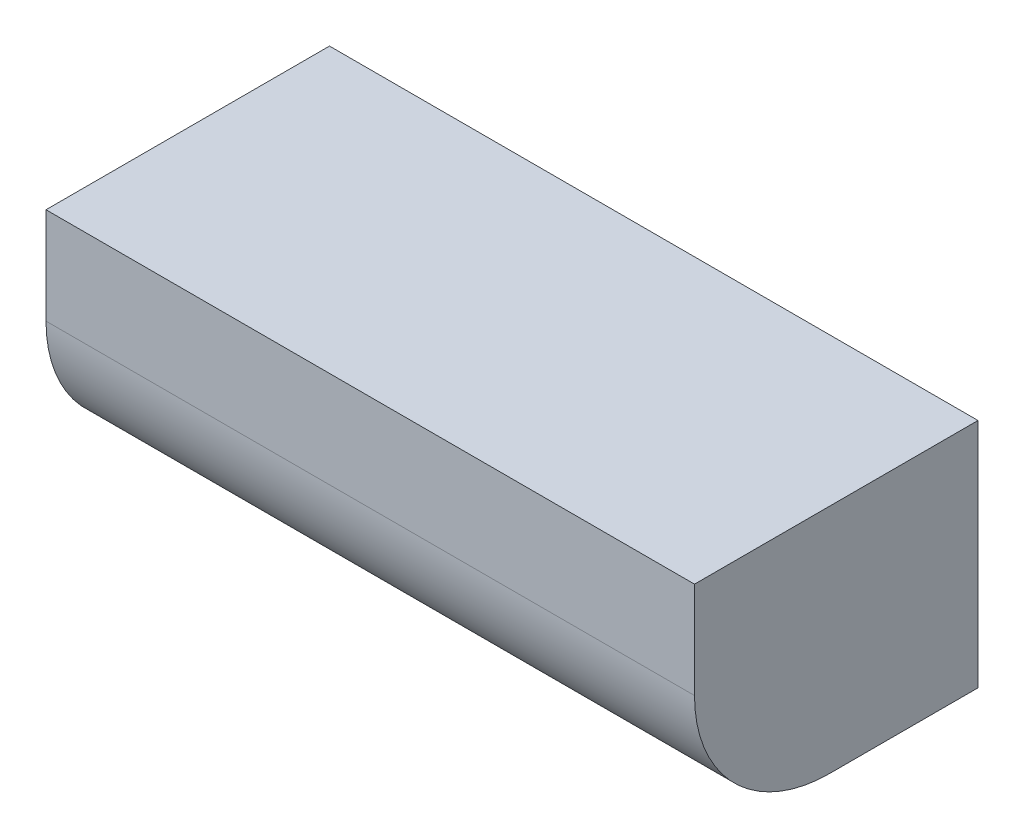
ISO-10303-21;
HEADER;
FILE_DESCRIPTION(('STEP AP214'),'2;1');
FILE_NAME('part.step','',(''),(''),'','','');
FILE_SCHEMA(('AUTOMOTIVE_DESIGN { 1 0 10303 214 1 1 1 1 }'));
ENDSEC;
DATA;
#1=APPLICATION_CONTEXT('core data for automotive mechanical design processes');
#2=APPLICATION_PROTOCOL_DEFINITION('international standard','automotive_design',2000,#1);
#3=PRODUCT_CONTEXT('',#1,'mechanical');
#4=PRODUCT('Part','Part','',(#3));
#5=PRODUCT_RELATED_PRODUCT_CATEGORY('part','',(#4));
#6=PRODUCT_DEFINITION_FORMATION('','',#4);
#7=PRODUCT_DEFINITION_CONTEXT('part definition',#1,'design');
#8=PRODUCT_DEFINITION('design','',#6,#7);
#9=PRODUCT_DEFINITION_SHAPE('','',#8);
#10=(LENGTH_UNIT() NAMED_UNIT(*) SI_UNIT(.MILLI.,.METRE.));
#11=(NAMED_UNIT(*) PLANE_ANGLE_UNIT() SI_UNIT($,.RADIAN.));
#12=(NAMED_UNIT(*) SI_UNIT($,.STERADIAN.) SOLID_ANGLE_UNIT());
#13=UNCERTAINTY_MEASURE_WITH_UNIT(LENGTH_MEASURE(1.E-05),#10,'distance_accuracy_value','');
#14=(GEOMETRIC_REPRESENTATION_CONTEXT(3) GLOBAL_UNCERTAINTY_ASSIGNED_CONTEXT((#13)) GLOBAL_UNIT_ASSIGNED_CONTEXT((#10,
#11,#12)) REPRESENTATION_CONTEXT('',''));
#15=CARTESIAN_POINT('',(0.,0.,0.));
#16=DIRECTION('',(0.,0.,1.));
#17=DIRECTION('',(1.,0.,0.));
#18=AXIS2_PLACEMENT_3D('',#15,#16,#17);
#19=CARTESIAN_POINT('',(0.,0.,10.));
#20=DIRECTION('',(1.,0.,0.));
#21=DIRECTION('',(0.,0.,-1.));
#22=AXIS2_PLACEMENT_3D('',#19,#20,#21);
#23=PLANE('',#22);
#24=DIRECTION('',(0.,0.,-1.));
#25=VECTOR('',#24,1.);
#26=CARTESIAN_POINT('',(0.,10.8609375,-17.8082122));
#27=LINE('',#26,#25);
#28=CARTESIAN_POINT('',(0.,10.8609375,-10.));
#29=VERTEX_POINT('',#28);
#30=CARTESIAN_POINT('',(0.,10.8609375,-20.9832122));
#31=VERTEX_POINT('',#30);
#32=EDGE_CURVE('E109',#29,#31,#27,.T.);
#33=ORIENTED_EDGE('',*,*,#32,.F.);
#34=CARTESIAN_POINT('',(0.,20.8609375,-10.));
#35=DIRECTION('',(1.,0.,0.));
#36=DIRECTION('',(0.,0.,-1.));
#37=AXIS2_PLACEMENT_3D('',#34,#35,#36);
#38=CIRCLE('',#37,10.);
#39=CARTESIAN_POINT('',(0.,20.8609374999999,0.));
#40=VERTEX_POINT('',#39);
#41=EDGE_CURVE('E106',#40,#29,#38,.T.);
#42=ORIENTED_EDGE('',*,*,#41,.F.);
#43=DIRECTION('',(0.,-1.,0.));
#44=VECTOR('',#43,1.);
#45=CARTESIAN_POINT('',(0.,28.,0.));
#46=LINE('',#45,#44);
#47=CARTESIAN_POINT('',(0.,28.,0.));
#48=VERTEX_POINT('',#47);
#49=EDGE_CURVE('E85',#48,#40,#46,.T.);
#50=ORIENTED_EDGE('',*,*,#49,.F.);
#51=DIRECTION('',(0.,0.,-1.));
#52=VECTOR('',#51,1.);
#53=CARTESIAN_POINT('',(0.,28.,-17.8082122));
#54=LINE('',#53,#52);
#55=CARTESIAN_POINT('',(0.,28.,-20.9832122));
#56=VERTEX_POINT('',#55);
#57=EDGE_CURVE('E11',#48,#56,#54,.T.);
#58=ORIENTED_EDGE('',*,*,#57,.T.);
#59=DIRECTION('',(0.,1.,0.));
#60=VECTOR('',#59,1.);
#61=CARTESIAN_POINT('',(0.,10.8609375,-20.9832122));
#62=LINE('',#61,#60);
#63=EDGE_CURVE('E83',#31,#56,#62,.T.);
#64=ORIENTED_EDGE('',*,*,#63,.F.);
#65=EDGE_LOOP('',(#33,#42,#50,#58,#64));
#66=FACE_BOUND('',#65,.T.);
#67=ADVANCED_FACE('F33',(#66),#23,.F.);
#68=CARTESIAN_POINT('',(48.,0.,10.));
#69=DIRECTION('',(-1.,0.,0.));
#70=DIRECTION('',(0.,0.,1.));
#71=AXIS2_PLACEMENT_3D('',#68,#69,#70);
#72=PLANE('',#71);
#73=DIRECTION('',(0.,0.,-1.));
#74=VECTOR('',#73,1.);
#75=CARTESIAN_POINT('',(48.,10.8609375,-17.8082122));
#76=LINE('',#75,#74);
#77=CARTESIAN_POINT('',(48.,10.8609375,-10.));
#78=VERTEX_POINT('',#77);
#79=CARTESIAN_POINT('',(48.,10.8609375,-20.9832122));
#80=VERTEX_POINT('',#79);
#81=EDGE_CURVE('E107',#78,#80,#76,.T.);
#82=ORIENTED_EDGE('',*,*,#81,.T.);
#83=DIRECTION('',(0.,-1.,0.));
#84=VECTOR('',#83,1.);
#85=CARTESIAN_POINT('',(48.,10.8609375,-20.9832122));
#86=LINE('',#85,#84);
#87=CARTESIAN_POINT('',(48.,28.,-20.9832122));
#88=VERTEX_POINT('',#87);
#89=EDGE_CURVE('E95',#88,#80,#86,.T.);
#90=ORIENTED_EDGE('',*,*,#89,.F.);
#91=DIRECTION('',(0.,0.,1.));
#92=VECTOR('',#91,1.);
#93=CARTESIAN_POINT('',(48.,28.,-17.8082122));
#94=LINE('',#93,#92);
#95=CARTESIAN_POINT('',(48.,28.,0.));
#96=VERTEX_POINT('',#95);
#97=EDGE_CURVE('E91',#88,#96,#94,.T.);
#98=ORIENTED_EDGE('',*,*,#97,.T.);
#99=DIRECTION('',(0.,-1.,0.));
#100=VECTOR('',#99,1.);
#101=CARTESIAN_POINT('',(48.,28.,0.));
#102=LINE('',#101,#100);
#103=CARTESIAN_POINT('',(48.,20.8609374999999,0.));
#104=VERTEX_POINT('',#103);
#105=EDGE_CURVE('E47',#96,#104,#102,.T.);
#106=ORIENTED_EDGE('',*,*,#105,.T.);
#107=CARTESIAN_POINT('',(48.,20.8609375,-10.));
#108=DIRECTION('',(1.,0.,0.));
#109=DIRECTION('',(0.,0.,-1.));
#110=AXIS2_PLACEMENT_3D('',#107,#108,#109);
#111=CIRCLE('',#110,10.);
#112=EDGE_CURVE('E112',#104,#78,#111,.T.);
#113=ORIENTED_EDGE('',*,*,#112,.T.);
#114=EDGE_LOOP('',(#82,#90,#98,#106,#113));
#115=FACE_BOUND('',#114,.T.);
#116=ADVANCED_FACE('F120',(#115),#72,.F.);
#117=CARTESIAN_POINT('',(-24.7159844056258,28.,-17.8082122));
#118=DIRECTION('',(0.,1.,0.));
#119=DIRECTION('',(0.,0.,1.));
#120=AXIS2_PLACEMENT_3D('',#117,#118,#119);
#121=PLANE('',#120);
#122=ORIENTED_EDGE('',*,*,#57,.F.);
#123=DIRECTION('',(1.,0.,0.));
#124=VECTOR('',#123,1.);
#125=CARTESIAN_POINT('',(-24.7159844056258,28.,0.));
#126=LINE('',#125,#124);
#127=EDGE_CURVE('E40',#48,#96,#126,.T.);
#128=ORIENTED_EDGE('',*,*,#127,.T.);
#129=ORIENTED_EDGE('',*,*,#97,.F.);
#130=DIRECTION('',(1.,0.,0.));
#131=VECTOR('',#130,1.);
#132=CARTESIAN_POINT('',(0.,28.,-20.9832122));
#133=LINE('',#132,#131);
#134=EDGE_CURVE('E88',#56,#88,#133,.T.);
#135=ORIENTED_EDGE('',*,*,#134,.F.);
#136=EDGE_LOOP('',(#122,#128,#129,#135));
#137=FACE_BOUND('',#136,.T.);
#138=ADVANCED_FACE('F89',(#137),#121,.T.);
#139=CARTESIAN_POINT('',(0.,10.8609375,-17.8082122));
#140=DIRECTION('',(0.,-1.,0.));
#141=DIRECTION('',(0.,0.,-1.));
#142=AXIS2_PLACEMENT_3D('',#139,#140,#141);
#143=PLANE('',#142);
#144=ORIENTED_EDGE('',*,*,#81,.F.);
#145=DIRECTION('',(1.,0.,0.));
#146=VECTOR('',#145,1.);
#147=CARTESIAN_POINT('',(0.,10.8609375,-10.));
#148=LINE('',#147,#146);
#149=EDGE_CURVE('E116',#29,#78,#148,.T.);
#150=ORIENTED_EDGE('',*,*,#149,.F.);
#151=ORIENTED_EDGE('',*,*,#32,.T.);
#152=DIRECTION('',(-1.,0.,0.));
#153=VECTOR('',#152,1.);
#154=CARTESIAN_POINT('',(0.,10.8609375,-20.9832122));
#155=LINE('',#154,#153);
#156=EDGE_CURVE('E100',#80,#31,#155,.T.);
#157=ORIENTED_EDGE('',*,*,#156,.F.);
#158=EDGE_LOOP('',(#144,#150,#151,#157));
#159=FACE_BOUND('',#158,.T.);
#160=ADVANCED_FACE('F123',(#159),#143,.T.);
#161=CARTESIAN_POINT('',(0.,20.8609375,-10.));
#162=DIRECTION('',(1.,0.,0.));
#163=DIRECTION('',(0.,0.,-1.));
#164=AXIS2_PLACEMENT_3D('',#161,#162,#163);
#165=CYLINDRICAL_SURFACE('',#164,10.);
#166=ORIENTED_EDGE('',*,*,#112,.F.);
#167=DIRECTION('',(1.,0.,0.));
#168=VECTOR('',#167,1.);
#169=CARTESIAN_POINT('',(0.,20.8609374999999,0.));
#170=LINE('',#169,#168);
#171=EDGE_CURVE('E54',#40,#104,#170,.T.);
#172=ORIENTED_EDGE('',*,*,#171,.F.);
#173=ORIENTED_EDGE('',*,*,#41,.T.);
#174=ORIENTED_EDGE('',*,*,#149,.T.);
#175=EDGE_LOOP('',(#166,#172,#173,#174));
#176=FACE_BOUND('',#175,.T.);
#177=ADVANCED_FACE('F124',(#176),#165,.T.);
#178=CARTESIAN_POINT('',(0.,28.,0.));
#179=DIRECTION('',(0.,0.,1.));
#180=DIRECTION('',(0.,-1.,0.));
#181=AXIS2_PLACEMENT_3D('',#178,#179,#180);
#182=PLANE('',#181);
#183=ORIENTED_EDGE('',*,*,#105,.F.);
#184=ORIENTED_EDGE('',*,*,#127,.F.);
#185=ORIENTED_EDGE('',*,*,#49,.T.);
#186=ORIENTED_EDGE('',*,*,#171,.T.);
#187=EDGE_LOOP('',(#183,#184,#185,#186));
#188=FACE_BOUND('',#187,.T.);
#189=ADVANCED_FACE('F126',(#188),#182,.T.);
#190=CARTESIAN_POINT('',(0.,0.,-20.9832122));
#191=DIRECTION('',(0.,0.,-1.));
#192=DIRECTION('',(0.,1.,0.));
#193=AXIS2_PLACEMENT_3D('',#190,#191,#192);
#194=PLANE('',#193);
#195=ORIENTED_EDGE('',*,*,#63,.T.);
#196=ORIENTED_EDGE('',*,*,#134,.T.);
#197=ORIENTED_EDGE('',*,*,#89,.T.);
#198=ORIENTED_EDGE('',*,*,#156,.T.);
#199=EDGE_LOOP('',(#195,#196,#197,#198));
#200=FACE_BOUND('',#199,.T.);
#201=ADVANCED_FACE('F98',(#200),#194,.T.);
#202=CLOSED_SHELL('',(#67,#116,#138,#160,#177,#189,#201));
#203=MANIFOLD_SOLID_BREP('B2',#202);
#204=ADVANCED_BREP_SHAPE_REPRESENTATION('',(#18,#203),#14);
#205=SHAPE_DEFINITION_REPRESENTATION(#9,#204);
ENDSEC;
END-ISO-10303-21;
